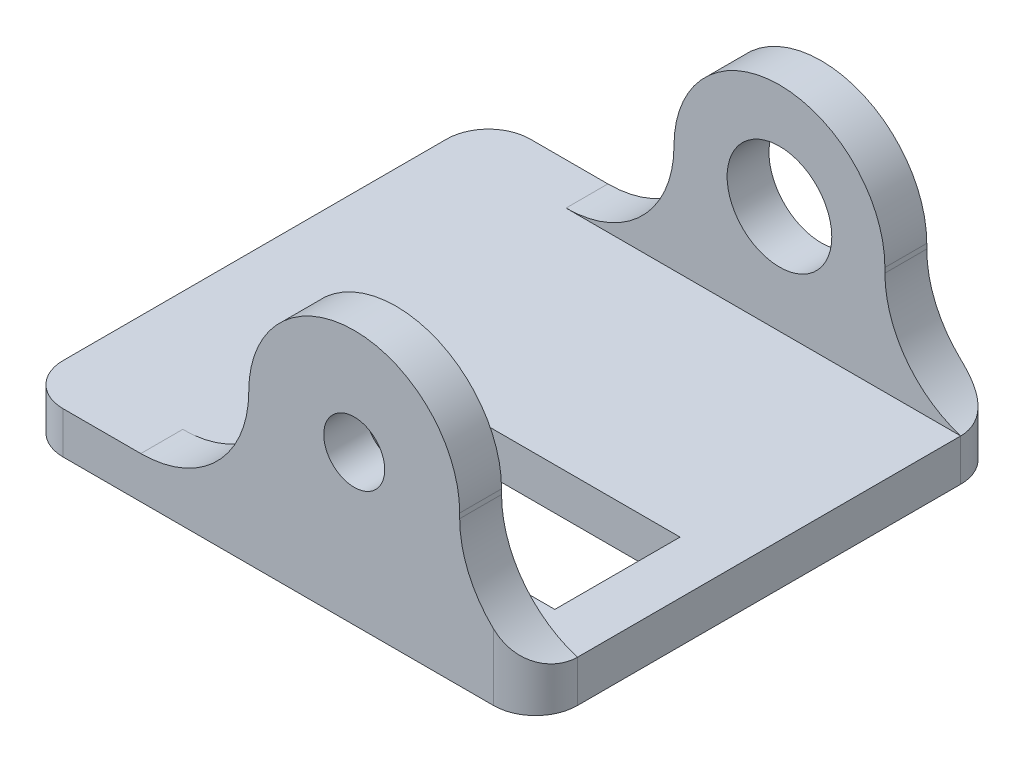
ISO-10303-21;
HEADER;
FILE_DESCRIPTION(('STEP AP214'),'2;1');
FILE_NAME('part.step','',(''),(''),'','','');
FILE_SCHEMA(('AUTOMOTIVE_DESIGN { 1 0 10303 214 1 1 1 1 }'));
ENDSEC;
DATA;
#1=APPLICATION_CONTEXT('core data for automotive mechanical design processes');
#2=APPLICATION_PROTOCOL_DEFINITION('international standard','automotive_design',2000,#1);
#3=PRODUCT_CONTEXT('',#1,'mechanical');
#4=PRODUCT('Part','Part','',(#3));
#5=PRODUCT_RELATED_PRODUCT_CATEGORY('part','',(#4));
#6=PRODUCT_DEFINITION_FORMATION('','',#4);
#7=PRODUCT_DEFINITION_CONTEXT('part definition',#1,'design');
#8=PRODUCT_DEFINITION('design','',#6,#7);
#9=PRODUCT_DEFINITION_SHAPE('','',#8);
#10=(LENGTH_UNIT() NAMED_UNIT(*) SI_UNIT(.MILLI.,.METRE.));
#11=(NAMED_UNIT(*) PLANE_ANGLE_UNIT() SI_UNIT($,.RADIAN.));
#12=(NAMED_UNIT(*) SI_UNIT($,.STERADIAN.) SOLID_ANGLE_UNIT());
#13=UNCERTAINTY_MEASURE_WITH_UNIT(LENGTH_MEASURE(1.E-05),#10,'distance_accuracy_value','');
#14=(GEOMETRIC_REPRESENTATION_CONTEXT(3) GLOBAL_UNCERTAINTY_ASSIGNED_CONTEXT((#13)) GLOBAL_UNIT_ASSIGNED_CONTEXT((#10,
#11,#12)) REPRESENTATION_CONTEXT('',''));
#15=CARTESIAN_POINT('',(0.,0.,0.));
#16=DIRECTION('',(0.,0.,1.));
#17=DIRECTION('',(1.,0.,0.));
#18=AXIS2_PLACEMENT_3D('',#15,#16,#17);
#19=CARTESIAN_POINT('',(0.,6.35,0.));
#20=DIRECTION('',(0.,-1.,0.));
#21=DIRECTION('',(0.,0.,-1.));
#22=AXIS2_PLACEMENT_3D('',#19,#20,#21);
#23=PLANE('',#22);
#24=DIRECTION('',(0.,0.,1.));
#25=VECTOR('',#24,1.);
#26=CARTESIAN_POINT('',(-50.5,6.35,0.));
#27=LINE('',#26,#25);
#28=CARTESIAN_POINT('',(-50.5,6.35,-44.08));
#29=VERTEX_POINT('',#28);
#30=CARTESIAN_POINT('',(-50.5,6.35,14.08));
#31=VERTEX_POINT('',#30);
#32=EDGE_CURVE('E506',#29,#31,#27,.T.);
#33=ORIENTED_EDGE('',*,*,#32,.T.);
#34=CARTESIAN_POINT('',(-44.15,6.34999999999999,14.08));
#35=DIRECTION('',(0.,-1.,0.));
#36=DIRECTION('',(0.,0.,-1.));
#37=AXIS2_PLACEMENT_3D('',#34,#35,#36);
#38=CIRCLE('',#37,6.35);
#39=CARTESIAN_POINT('',(-44.15,6.35,20.43));
#40=VERTEX_POINT('',#39);
#41=EDGE_CURVE('E11',#31,#40,#38,.F.);
#42=ORIENTED_EDGE('',*,*,#41,.T.);
#43=DIRECTION('',(1.,0.,0.));
#44=VECTOR('',#43,1.);
#45=CARTESIAN_POINT('',(-27.5,6.35,20.43));
#46=LINE('',#45,#44);
#47=CARTESIAN_POINT('',(-32.3799999723013,6.35,20.43));
#48=VERTEX_POINT('',#47);
#49=EDGE_CURVE('E298',#40,#48,#46,.T.);
#50=ORIENTED_EDGE('',*,*,#49,.T.);
#51=DIRECTION('',(0.,0.,1.));
#52=VECTOR('',#51,1.);
#53=CARTESIAN_POINT('',(-32.3799999723013,6.35,0.));
#54=LINE('',#53,#52);
#55=CARTESIAN_POINT('',(-32.3799999723013,6.35000000000001,14.08));
#56=VERTEX_POINT('',#55);
#57=EDGE_CURVE('E315',#48,#56,#54,.F.);
#58=ORIENTED_EDGE('',*,*,#57,.T.);
#59=DIRECTION('',(1.,0.,0.));
#60=VECTOR('',#59,1.);
#61=CARTESIAN_POINT('',(16.,6.35,14.08));
#62=LINE('',#61,#60);
#63=CARTESIAN_POINT('',(27.5,6.35,14.08));
#64=VERTEX_POINT('',#63);
#65=EDGE_CURVE('E192',#56,#64,#62,.T.);
#66=ORIENTED_EDGE('',*,*,#65,.T.);
#67=DIRECTION('',(0.,0.,-1.));
#68=VECTOR('',#67,1.);
#69=CARTESIAN_POINT('',(27.5,6.35,20.43));
#70=LINE('',#69,#68);
#71=CARTESIAN_POINT('',(27.5,6.35,-44.08));
#72=VERTEX_POINT('',#71);
#73=EDGE_CURVE('E290',#64,#72,#70,.T.);
#74=ORIENTED_EDGE('',*,*,#73,.T.);
#75=DIRECTION('',(1.,0.,0.));
#76=VECTOR('',#75,1.);
#77=CARTESIAN_POINT('',(-16.,6.35000000000001,-44.08));
#78=LINE('',#77,#76);
#79=CARTESIAN_POINT('',(-32.3799999723013,6.35000000000001,-44.08));
#80=VERTEX_POINT('',#79);
#81=EDGE_CURVE('E229',#80,#72,#78,.T.);
#82=ORIENTED_EDGE('',*,*,#81,.F.);
#83=DIRECTION('',(0.,0.,1.));
#84=VECTOR('',#83,1.);
#85=CARTESIAN_POINT('',(-32.3799999723013,6.35,-50.43));
#86=LINE('',#85,#84);
#87=CARTESIAN_POINT('',(-32.3799999723013,6.35,-50.43));
#88=VERTEX_POINT('',#87);
#89=EDGE_CURVE('E301',#80,#88,#86,.F.);
#90=ORIENTED_EDGE('',*,*,#89,.T.);
#91=DIRECTION('',(-1.,0.,0.));
#92=VECTOR('',#91,1.);
#93=CARTESIAN_POINT('',(-27.5,6.35,-50.43));
#94=LINE('',#93,#92);
#95=CARTESIAN_POINT('',(-44.15,6.35,-50.43));
#96=VERTEX_POINT('',#95);
#97=EDGE_CURVE('E294',#88,#96,#94,.T.);
#98=ORIENTED_EDGE('',*,*,#97,.T.);
#99=CARTESIAN_POINT('',(-44.15,6.35,-44.08));
#100=DIRECTION('',(0.,-1.,0.));
#101=DIRECTION('',(0.,0.,-1.));
#102=AXIS2_PLACEMENT_3D('',#99,#100,#101);
#103=CIRCLE('',#102,6.35);
#104=EDGE_CURVE('E50',#96,#29,#103,.F.);
#105=ORIENTED_EDGE('',*,*,#104,.T.);
#106=EDGE_LOOP('',(#33,#42,#50,#58,#66,#74,#82,#90,#98,#105));
#107=FACE_BOUND('',#106,.T.);
#108=DIRECTION('',(0.,0.,-1.));
#109=VECTOR('',#108,1.);
#110=CARTESIAN_POINT('',(19.5,6.35,9.5));
#111=LINE('',#110,#109);
#112=CARTESIAN_POINT('',(19.5,6.35,9.5));
#113=VERTEX_POINT('',#112);
#114=CARTESIAN_POINT('',(19.5,6.35,-9.5));
#115=VERTEX_POINT('',#114);
#116=EDGE_CURVE('E247',#113,#115,#111,.T.);
#117=ORIENTED_EDGE('',*,*,#116,.F.);
#118=DIRECTION('',(1.,0.,0.));
#119=VECTOR('',#118,1.);
#120=CARTESIAN_POINT('',(-19.5,6.35,9.5));
#121=LINE('',#120,#119);
#122=CARTESIAN_POINT('',(-19.5,6.35,9.5));
#123=VERTEX_POINT('',#122);
#124=EDGE_CURVE('E258',#123,#113,#121,.T.);
#125=ORIENTED_EDGE('',*,*,#124,.F.);
#126=DIRECTION('',(0.,0.,1.));
#127=VECTOR('',#126,1.);
#128=CARTESIAN_POINT('',(-19.5,6.35,9.5));
#129=LINE('',#128,#127);
#130=CARTESIAN_POINT('',(-19.5,6.35,-9.5));
#131=VERTEX_POINT('',#130);
#132=EDGE_CURVE('E254',#131,#123,#129,.T.);
#133=ORIENTED_EDGE('',*,*,#132,.F.);
#134=DIRECTION('',(-1.,0.,0.));
#135=VECTOR('',#134,1.);
#136=CARTESIAN_POINT('',(-19.5,6.35,-9.5));
#137=LINE('',#136,#135);
#138=EDGE_CURVE('E250',#115,#131,#137,.T.);
#139=ORIENTED_EDGE('',*,*,#138,.F.);
#140=EDGE_LOOP('',(#117,#125,#133,#139));
#141=FACE_BOUND('',#140,.T.);
#142=ADVANCED_FACE('F41',(#107,#141),#23,.F.);
#143=CARTESIAN_POINT('',(0.,0.,0.));
#144=DIRECTION('',(0.,-1.,0.));
#145=DIRECTION('',(0.,0.,-1.));
#146=AXIS2_PLACEMENT_3D('',#143,#144,#145);
#147=PLANE('',#146);
#148=DIRECTION('',(-1.,0.,0.));
#149=VECTOR('',#148,1.);
#150=CARTESIAN_POINT('',(-27.5,0.,-50.43));
#151=LINE('',#150,#149);
#152=CARTESIAN_POINT('',(21.15,0.,-50.43));
#153=VERTEX_POINT('',#152);
#154=CARTESIAN_POINT('',(-44.15,0.,-50.43));
#155=VERTEX_POINT('',#154);
#156=EDGE_CURVE('E305',#153,#155,#151,.T.);
#157=ORIENTED_EDGE('',*,*,#156,.F.);
#158=CARTESIAN_POINT('',(21.15,0.,-44.08));
#159=DIRECTION('',(0.,-1.,0.));
#160=DIRECTION('',(0.,0.,-1.));
#161=AXIS2_PLACEMENT_3D('',#158,#159,#160);
#162=CIRCLE('',#161,6.35);
#163=CARTESIAN_POINT('',(27.5,0.,-44.08));
#164=VERTEX_POINT('',#163);
#165=EDGE_CURVE('E374',#153,#164,#162,.T.);
#166=ORIENTED_EDGE('',*,*,#165,.T.);
#167=DIRECTION('',(0.,0.,-1.));
#168=VECTOR('',#167,1.);
#169=CARTESIAN_POINT('',(27.5,0.,20.43));
#170=LINE('',#169,#168);
#171=CARTESIAN_POINT('',(27.5,0.,14.08));
#172=VERTEX_POINT('',#171);
#173=EDGE_CURVE('E289',#172,#164,#170,.T.);
#174=ORIENTED_EDGE('',*,*,#173,.F.);
#175=CARTESIAN_POINT('',(21.15,0.,14.08));
#176=DIRECTION('',(0.,-1.,0.));
#177=DIRECTION('',(0.,0.,-1.));
#178=AXIS2_PLACEMENT_3D('',#175,#176,#177);
#179=CIRCLE('',#178,6.35);
#180=CARTESIAN_POINT('',(21.15,0.,20.43));
#181=VERTEX_POINT('',#180);
#182=EDGE_CURVE('E371',#172,#181,#179,.T.);
#183=ORIENTED_EDGE('',*,*,#182,.T.);
#184=DIRECTION('',(1.,0.,0.));
#185=VECTOR('',#184,1.);
#186=CARTESIAN_POINT('',(-27.5,0.,20.43));
#187=LINE('',#186,#185);
#188=CARTESIAN_POINT('',(-44.15,0.,20.43));
#189=VERTEX_POINT('',#188);
#190=EDGE_CURVE('E295',#189,#181,#187,.T.);
#191=ORIENTED_EDGE('',*,*,#190,.F.);
#192=CARTESIAN_POINT('',(-44.15,0.,14.08));
#193=DIRECTION('',(0.,-1.,0.));
#194=DIRECTION('',(0.,0.,-1.));
#195=AXIS2_PLACEMENT_3D('',#192,#193,#194);
#196=CIRCLE('',#195,6.35);
#197=CARTESIAN_POINT('',(-50.5,0.,14.08));
#198=VERTEX_POINT('',#197);
#199=EDGE_CURVE('E368',#189,#198,#196,.T.);
#200=ORIENTED_EDGE('',*,*,#199,.T.);
#201=DIRECTION('',(0.,0.,1.));
#202=VECTOR('',#201,1.);
#203=CARTESIAN_POINT('',(-50.5,0.,0.));
#204=LINE('',#203,#202);
#205=CARTESIAN_POINT('',(-50.5,0.,-44.08));
#206=VERTEX_POINT('',#205);
#207=EDGE_CURVE('E214',#206,#198,#204,.T.);
#208=ORIENTED_EDGE('',*,*,#207,.F.);
#209=CARTESIAN_POINT('',(-44.15,0.,-44.08));
#210=DIRECTION('',(0.,-1.,0.));
#211=DIRECTION('',(0.,0.,-1.));
#212=AXIS2_PLACEMENT_3D('',#209,#210,#211);
#213=CIRCLE('',#212,6.35);
#214=EDGE_CURVE('E365',#206,#155,#213,.T.);
#215=ORIENTED_EDGE('',*,*,#214,.T.);
#216=EDGE_LOOP('',(#157,#166,#174,#183,#191,#200,#208,#215));
#217=FACE_BOUND('',#216,.T.);
#218=DIRECTION('',(1.,0.,0.));
#219=VECTOR('',#218,1.);
#220=CARTESIAN_POINT('',(-19.5,0.,9.5));
#221=LINE('',#220,#219);
#222=CARTESIAN_POINT('',(-19.5,0.,9.5));
#223=VERTEX_POINT('',#222);
#224=CARTESIAN_POINT('',(19.5,0.,9.5));
#225=VERTEX_POINT('',#224);
#226=EDGE_CURVE('E251',#223,#225,#221,.T.);
#227=ORIENTED_EDGE('',*,*,#226,.T.);
#228=DIRECTION('',(0.,0.,-1.));
#229=VECTOR('',#228,1.);
#230=CARTESIAN_POINT('',(19.5,0.,9.5));
#231=LINE('',#230,#229);
#232=CARTESIAN_POINT('',(19.5,0.,-9.5));
#233=VERTEX_POINT('',#232);
#234=EDGE_CURVE('E246',#225,#233,#231,.T.);
#235=ORIENTED_EDGE('',*,*,#234,.T.);
#236=DIRECTION('',(-1.,0.,0.));
#237=VECTOR('',#236,1.);
#238=CARTESIAN_POINT('',(-19.5,0.,-9.5));
#239=LINE('',#238,#237);
#240=CARTESIAN_POINT('',(-19.5,0.,-9.5));
#241=VERTEX_POINT('',#240);
#242=EDGE_CURVE('E265',#233,#241,#239,.T.);
#243=ORIENTED_EDGE('',*,*,#242,.T.);
#244=DIRECTION('',(0.,0.,1.));
#245=VECTOR('',#244,1.);
#246=CARTESIAN_POINT('',(-19.5,0.,9.5));
#247=LINE('',#246,#245);
#248=EDGE_CURVE('E269',#241,#223,#247,.T.);
#249=ORIENTED_EDGE('',*,*,#248,.T.);
#250=EDGE_LOOP('',(#227,#235,#243,#249));
#251=FACE_BOUND('',#250,.T.);
#252=ADVANCED_FACE('F421',(#217,#251),#147,.T.);
#253=CARTESIAN_POINT('',(27.5,6.35,20.43));
#254=DIRECTION('',(-1.,0.,0.));
#255=DIRECTION('',(0.,0.,1.));
#256=AXIS2_PLACEMENT_3D('',#253,#254,#255);
#257=PLANE('',#256);
#258=ORIENTED_EDGE('',*,*,#173,.T.);
#259=DIRECTION('',(0.,-1.,0.));
#260=VECTOR('',#259,1.);
#261=CARTESIAN_POINT('',(27.5,6.35,-44.08));
#262=LINE('',#261,#260);
#263=EDGE_CURVE('E381',#164,#72,#262,.F.);
#264=ORIENTED_EDGE('',*,*,#263,.T.);
#265=ORIENTED_EDGE('',*,*,#73,.F.);
#266=DIRECTION('',(0.,-1.,0.));
#267=VECTOR('',#266,1.);
#268=CARTESIAN_POINT('',(27.5,6.35,14.08));
#269=LINE('',#268,#267);
#270=EDGE_CURVE('E377',#64,#172,#269,.T.);
#271=ORIENTED_EDGE('',*,*,#270,.T.);
#272=EDGE_LOOP('',(#258,#264,#265,#271));
#273=FACE_BOUND('',#272,.T.);
#274=ADVANCED_FACE('F426',(#273),#257,.F.);
#275=CARTESIAN_POINT('',(-27.5,6.35,-50.43));
#276=DIRECTION('',(0.,0.,1.));
#277=DIRECTION('',(1.,0.,0.));
#278=AXIS2_PLACEMENT_3D('',#275,#276,#277);
#279=PLANE('',#278);
#280=CARTESIAN_POINT('',(32.38,21.9861760031025,-50.43));
#281=DIRECTION('',(0.,0.,1.));
#282=DIRECTION('',(1.,0.,0.));
#283=AXIS2_PLACEMENT_3D('',#280,#281,#282);
#284=CIRCLE('',#283,16.38);
#285=CARTESIAN_POINT('',(16.,21.9861760031025,-50.43));
#286=VERTEX_POINT('',#285);
#287=CARTESIAN_POINT('',(21.15,10.0617682609965,-50.43));
#288=VERTEX_POINT('',#287);
#289=EDGE_CURVE('E337',#286,#288,#284,.T.);
#290=ORIENTED_EDGE('',*,*,#289,.T.);
#291=DIRECTION('',(0.,-1.,0.));
#292=VECTOR('',#291,1.);
#293=CARTESIAN_POINT('',(21.15,6.35,-50.43));
#294=LINE('',#293,#292);
#295=EDGE_CURVE('E361',#288,#153,#294,.T.);
#296=ORIENTED_EDGE('',*,*,#295,.T.);
#297=ORIENTED_EDGE('',*,*,#156,.T.);
#298=DIRECTION('',(0.,1.,0.));
#299=VECTOR('',#298,1.);
#300=CARTESIAN_POINT('',(-44.15,6.35,-50.43));
#301=LINE('',#300,#299);
#302=EDGE_CURVE('E357',#155,#96,#301,.T.);
#303=ORIENTED_EDGE('',*,*,#302,.T.);
#304=ORIENTED_EDGE('',*,*,#97,.F.);
#305=CARTESIAN_POINT('',(-32.3799999723013,22.73,-50.43));
#306=DIRECTION('',(0.,0.,1.));
#307=DIRECTION('',(1.,0.,0.));
#308=AXIS2_PLACEMENT_3D('',#305,#306,#307);
#309=CIRCLE('',#308,16.38);
#310=CARTESIAN_POINT('',(-15.9999999863132,22.7293224833482,-50.43));
#311=VERTEX_POINT('',#310);
#312=EDGE_CURVE('E350',#88,#311,#309,.T.);
#313=ORIENTED_EDGE('',*,*,#312,.T.);
#314=CARTESIAN_POINT('',(0.,22.7286606844209,-50.43));
#315=DIRECTION('',(0.,0.,1.));
#316=DIRECTION('',(1.,0.,0.));
#317=AXIS2_PLACEMENT_3D('',#314,#315,#316);
#318=CIRCLE('',#317,16.);
#319=CARTESIAN_POINT('',(16.,22.7286606844209,-50.43));
#320=VERTEX_POINT('',#319);
#321=EDGE_CURVE('E221',#320,#311,#318,.T.);
#322=ORIENTED_EDGE('',*,*,#321,.F.);
#323=DIRECTION('',(0.,1.,0.));
#324=VECTOR('',#323,1.);
#325=CARTESIAN_POINT('',(16.,22.7286606844209,-50.43));
#326=LINE('',#325,#324);
#327=EDGE_CURVE('E230',#286,#320,#326,.T.);
#328=ORIENTED_EDGE('',*,*,#327,.F.);
#329=EDGE_LOOP('',(#290,#296,#297,#303,#304,#313,#322,#328));
#330=FACE_BOUND('',#329,.T.);
#331=CARTESIAN_POINT('',(0.,22.7286606844209,-50.43));
#332=DIRECTION('',(0.,0.,1.));
#333=DIRECTION('',(1.,0.,0.));
#334=AXIS2_PLACEMENT_3D('',#331,#332,#333);
#335=CIRCLE('',#334,7.94);
#336=CARTESIAN_POINT('',(7.94,22.7286606844209,-50.43));
#337=VERTEX_POINT('',#336);
#338=EDGE_CURVE('E202',#337,#337,#335,.T.);
#339=ORIENTED_EDGE('',*,*,#338,.T.);
#340=EDGE_LOOP('',(#339));
#341=FACE_BOUND('',#340,.T.);
#342=ADVANCED_FACE('F437',(#330,#341),#279,.F.);
#343=CARTESIAN_POINT('',(-27.5,6.35,20.43));
#344=DIRECTION('',(0.,0.,-1.));
#345=DIRECTION('',(-1.,0.,0.));
#346=AXIS2_PLACEMENT_3D('',#343,#344,#345);
#347=PLANE('',#346);
#348=CARTESIAN_POINT('',(0.,22.7286606844209,20.43));
#349=DIRECTION('',(0.,0.,-1.));
#350=DIRECTION('',(-1.,0.,0.));
#351=AXIS2_PLACEMENT_3D('',#348,#349,#350);
#352=CIRCLE('',#351,4.625);
#353=CARTESIAN_POINT('',(-4.625,22.7286606844209,20.43));
#354=VERTEX_POINT('',#353);
#355=EDGE_CURVE('E509',#354,#354,#352,.F.);
#356=ORIENTED_EDGE('',*,*,#355,.F.);
#357=EDGE_LOOP('',(#356));
#358=FACE_BOUND('',#357,.T.);
#359=ORIENTED_EDGE('',*,*,#190,.T.);
#360=DIRECTION('',(0.,-1.,0.));
#361=VECTOR('',#360,1.);
#362=CARTESIAN_POINT('',(21.15,6.35,20.43));
#363=LINE('',#362,#361);
#364=CARTESIAN_POINT('',(21.15,10.0617682609965,20.43));
#365=VERTEX_POINT('',#364);
#366=EDGE_CURVE('E488',#181,#365,#363,.F.);
#367=ORIENTED_EDGE('',*,*,#366,.T.);
#368=CARTESIAN_POINT('',(32.38,21.9861760031025,20.43));
#369=DIRECTION('',(0.,0.,-1.));
#370=DIRECTION('',(-1.,0.,0.));
#371=AXIS2_PLACEMENT_3D('',#368,#369,#370);
#372=CIRCLE('',#371,16.38);
#373=CARTESIAN_POINT('',(16.,21.9861760031025,20.43));
#374=VERTEX_POINT('',#373);
#375=EDGE_CURVE('E331',#365,#374,#372,.T.);
#376=ORIENTED_EDGE('',*,*,#375,.T.);
#377=DIRECTION('',(0.,1.,0.));
#378=VECTOR('',#377,1.);
#379=CARTESIAN_POINT('',(16.,6.35,20.43));
#380=LINE('',#379,#378);
#381=CARTESIAN_POINT('',(16.,22.7286606844209,20.43));
#382=VERTEX_POINT('',#381);
#383=EDGE_CURVE('E211',#374,#382,#380,.T.);
#384=ORIENTED_EDGE('',*,*,#383,.T.);
#385=CARTESIAN_POINT('',(0.,22.7286606844209,20.43));
#386=DIRECTION('',(0.,0.,1.));
#387=DIRECTION('',(-1.,0.,0.));
#388=AXIS2_PLACEMENT_3D('',#385,#386,#387);
#389=CIRCLE('',#388,16.);
#390=CARTESIAN_POINT('',(-15.9999999863132,22.7293224833482,20.43));
#391=VERTEX_POINT('',#390);
#392=EDGE_CURVE('E200',#382,#391,#389,.T.);
#393=ORIENTED_EDGE('',*,*,#392,.T.);
#394=CARTESIAN_POINT('',(-32.3799999723013,22.73,20.43));
#395=DIRECTION('',(0.,0.,-1.));
#396=DIRECTION('',(-1.,0.,0.));
#397=AXIS2_PLACEMENT_3D('',#394,#395,#396);
#398=CIRCLE('',#397,16.38);
#399=EDGE_CURVE('E344',#391,#48,#398,.T.);
#400=ORIENTED_EDGE('',*,*,#399,.T.);
#401=ORIENTED_EDGE('',*,*,#49,.F.);
#402=DIRECTION('',(0.,1.,0.));
#403=VECTOR('',#402,1.);
#404=CARTESIAN_POINT('',(-44.15,0.,20.43));
#405=LINE('',#404,#403);
#406=EDGE_CURVE('E393',#40,#189,#405,.F.);
#407=ORIENTED_EDGE('',*,*,#406,.T.);
#408=EDGE_LOOP('',(#359,#367,#376,#384,#393,#400,#401,#407));
#409=FACE_BOUND('',#408,.T.);
#410=ADVANCED_FACE('F434',(#358,#409),#347,.F.);
#411=CARTESIAN_POINT('',(19.5,6.35,9.5));
#412=DIRECTION('',(-1.,0.,0.));
#413=DIRECTION('',(0.,0.,1.));
#414=AXIS2_PLACEMENT_3D('',#411,#412,#413);
#415=PLANE('',#414);
#416=ORIENTED_EDGE('',*,*,#234,.F.);
#417=DIRECTION('',(0.,-1.,0.));
#418=VECTOR('',#417,1.);
#419=CARTESIAN_POINT('',(19.5,6.35,9.5));
#420=LINE('',#419,#418);
#421=EDGE_CURVE('E261',#113,#225,#420,.T.);
#422=ORIENTED_EDGE('',*,*,#421,.F.);
#423=ORIENTED_EDGE('',*,*,#116,.T.);
#424=DIRECTION('',(0.,-1.,0.));
#425=VECTOR('',#424,1.);
#426=CARTESIAN_POINT('',(19.5,6.35,-9.5));
#427=LINE('',#426,#425);
#428=EDGE_CURVE('E285',#115,#233,#427,.T.);
#429=ORIENTED_EDGE('',*,*,#428,.T.);
#430=EDGE_LOOP('',(#416,#422,#423,#429));
#431=FACE_BOUND('',#430,.T.);
#432=ADVANCED_FACE('F431',(#431),#415,.T.);
#433=CARTESIAN_POINT('',(-19.5,6.35,-9.5));
#434=DIRECTION('',(0.,0.,1.));
#435=DIRECTION('',(1.,0.,0.));
#436=AXIS2_PLACEMENT_3D('',#433,#434,#435);
#437=PLANE('',#436);
#438=ORIENTED_EDGE('',*,*,#242,.F.);
#439=ORIENTED_EDGE('',*,*,#428,.F.);
#440=ORIENTED_EDGE('',*,*,#138,.T.);
#441=DIRECTION('',(0.,-1.,0.));
#442=VECTOR('',#441,1.);
#443=CARTESIAN_POINT('',(-19.5,6.35,-9.5));
#444=LINE('',#443,#442);
#445=EDGE_CURVE('E282',#131,#241,#444,.T.);
#446=ORIENTED_EDGE('',*,*,#445,.T.);
#447=EDGE_LOOP('',(#438,#439,#440,#446));
#448=FACE_BOUND('',#447,.T.);
#449=ADVANCED_FACE('F555',(#448),#437,.T.);
#450=CARTESIAN_POINT('',(-19.5,6.35,9.5));
#451=DIRECTION('',(1.,0.,0.));
#452=DIRECTION('',(0.,0.,-1.));
#453=AXIS2_PLACEMENT_3D('',#450,#451,#452);
#454=PLANE('',#453);
#455=ORIENTED_EDGE('',*,*,#248,.F.);
#456=ORIENTED_EDGE('',*,*,#445,.F.);
#457=ORIENTED_EDGE('',*,*,#132,.T.);
#458=DIRECTION('',(0.,-1.,0.));
#459=VECTOR('',#458,1.);
#460=CARTESIAN_POINT('',(-19.5,6.35,9.5));
#461=LINE('',#460,#459);
#462=EDGE_CURVE('E279',#123,#223,#461,.T.);
#463=ORIENTED_EDGE('',*,*,#462,.T.);
#464=EDGE_LOOP('',(#455,#456,#457,#463));
#465=FACE_BOUND('',#464,.T.);
#466=ADVANCED_FACE('F552',(#465),#454,.T.);
#467=CARTESIAN_POINT('',(-19.5,6.35,9.5));
#468=DIRECTION('',(0.,0.,-1.));
#469=DIRECTION('',(-1.,0.,0.));
#470=AXIS2_PLACEMENT_3D('',#467,#468,#469);
#471=PLANE('',#470);
#472=ORIENTED_EDGE('',*,*,#226,.F.);
#473=ORIENTED_EDGE('',*,*,#462,.F.);
#474=ORIENTED_EDGE('',*,*,#124,.T.);
#475=ORIENTED_EDGE('',*,*,#421,.T.);
#476=EDGE_LOOP('',(#472,#473,#474,#475));
#477=FACE_BOUND('',#476,.T.);
#478=ADVANCED_FACE('F545',(#477),#471,.T.);
#479=CARTESIAN_POINT('',(0.,22.7286606844209,-44.08));
#480=DIRECTION('',(0.,0.,1.));
#481=DIRECTION('',(1.,0.,0.));
#482=AXIS2_PLACEMENT_3D('',#479,#480,#481);
#483=PLANE('',#482);
#484=CARTESIAN_POINT('',(0.,22.7286606844209,-44.08));
#485=DIRECTION('',(0.,0.,1.));
#486=DIRECTION('',(1.,0.,0.));
#487=AXIS2_PLACEMENT_3D('',#484,#485,#486);
#488=CIRCLE('',#487,16.);
#489=CARTESIAN_POINT('',(16.,22.7286606844209,-44.08));
#490=VERTEX_POINT('',#489);
#491=CARTESIAN_POINT('',(-15.9999999863132,22.7293224833482,-44.08));
#492=VERTEX_POINT('',#491);
#493=EDGE_CURVE('E225',#490,#492,#488,.T.);
#494=ORIENTED_EDGE('',*,*,#493,.T.);
#495=CARTESIAN_POINT('',(-32.3799999723013,22.73,-44.08));
#496=DIRECTION('',(0.,0.,1.));
#497=DIRECTION('',(1.,0.,0.));
#498=AXIS2_PLACEMENT_3D('',#495,#496,#497);
#499=CIRCLE('',#498,16.38);
#500=EDGE_CURVE('E353',#492,#80,#499,.F.);
#501=ORIENTED_EDGE('',*,*,#500,.T.);
#502=ORIENTED_EDGE('',*,*,#81,.T.);
#503=CARTESIAN_POINT('',(32.38,21.9861760031025,-44.08));
#504=DIRECTION('',(0.,0.,1.));
#505=DIRECTION('',(1.,0.,0.));
#506=AXIS2_PLACEMENT_3D('',#503,#504,#505);
#507=CIRCLE('',#506,16.38);
#508=CARTESIAN_POINT('',(16.,21.9861760031025,-44.08));
#509=VERTEX_POINT('',#508);
#510=EDGE_CURVE('E341',#72,#509,#507,.F.);
#511=ORIENTED_EDGE('',*,*,#510,.T.);
#512=DIRECTION('',(0.,1.,0.));
#513=VECTOR('',#512,1.);
#514=CARTESIAN_POINT('',(16.,22.7286606844209,-44.08));
#515=LINE('',#514,#513);
#516=EDGE_CURVE('E234',#509,#490,#515,.T.);
#517=ORIENTED_EDGE('',*,*,#516,.T.);
#518=EDGE_LOOP('',(#494,#501,#502,#511,#517));
#519=FACE_BOUND('',#518,.T.);
#520=CARTESIAN_POINT('',(0.,22.7286606844209,-44.08));
#521=DIRECTION('',(0.,0.,1.));
#522=DIRECTION('',(1.,0.,0.));
#523=AXIS2_PLACEMENT_3D('',#520,#521,#522);
#524=CIRCLE('',#523,7.94);
#525=CARTESIAN_POINT('',(7.94,22.7286606844209,-44.08));
#526=VERTEX_POINT('',#525);
#527=EDGE_CURVE('E217',#526,#526,#524,.T.);
#528=ORIENTED_EDGE('',*,*,#527,.F.);
#529=EDGE_LOOP('',(#528));
#530=FACE_BOUND('',#529,.T.);
#531=ADVANCED_FACE('F466',(#519,#530),#483,.T.);
#532=CARTESIAN_POINT('',(0.,22.7286606844209,-44.08));
#533=DIRECTION('',(0.,0.,-1.));
#534=DIRECTION('',(-1.,0.,0.));
#535=AXIS2_PLACEMENT_3D('',#532,#533,#534);
#536=CYLINDRICAL_SURFACE('',#535,16.);
#537=ORIENTED_EDGE('',*,*,#321,.T.);
#538=DIRECTION('',(0.,0.,-1.));
#539=VECTOR('',#538,1.);
#540=CARTESIAN_POINT('',(-15.9999999863132,22.7293224833482,-44.08));
#541=LINE('',#540,#539);
#542=EDGE_CURVE('E328',#311,#492,#541,.F.);
#543=ORIENTED_EDGE('',*,*,#542,.T.);
#544=ORIENTED_EDGE('',*,*,#493,.F.);
#545=DIRECTION('',(0.,0.,-1.));
#546=VECTOR('',#545,1.);
#547=CARTESIAN_POINT('',(16.,22.7286606844209,-44.08));
#548=LINE('',#547,#546);
#549=EDGE_CURVE('E237',#490,#320,#548,.T.);
#550=ORIENTED_EDGE('',*,*,#549,.T.);
#551=EDGE_LOOP('',(#537,#543,#544,#550));
#552=FACE_BOUND('',#551,.T.);
#553=ADVANCED_FACE('F463',(#552),#536,.T.);
#554=CARTESIAN_POINT('',(16.,22.7286606844209,-44.08));
#555=DIRECTION('',(-1.,0.,0.));
#556=DIRECTION('',(0.,-1.,0.));
#557=AXIS2_PLACEMENT_3D('',#554,#555,#556);
#558=PLANE('',#557);
#559=ORIENTED_EDGE('',*,*,#516,.F.);
#560=DIRECTION('',(0.,0.,-1.));
#561=VECTOR('',#560,1.);
#562=CARTESIAN_POINT('',(16.,21.9861760031025,-44.08));
#563=LINE('',#562,#561);
#564=EDGE_CURVE('E321',#509,#286,#563,.T.);
#565=ORIENTED_EDGE('',*,*,#564,.T.);
#566=ORIENTED_EDGE('',*,*,#327,.T.);
#567=ORIENTED_EDGE('',*,*,#549,.F.);
#568=EDGE_LOOP('',(#559,#565,#566,#567));
#569=FACE_BOUND('',#568,.T.);
#570=ADVANCED_FACE('F460',(#569),#558,.F.);
#571=CARTESIAN_POINT('',(0.,22.7286606844209,-44.08));
#572=DIRECTION('',(0.,0.,-1.));
#573=DIRECTION('',(-1.,0.,0.));
#574=AXIS2_PLACEMENT_3D('',#571,#572,#573);
#575=CYLINDRICAL_SURFACE('',#574,7.94);
#576=ORIENTED_EDGE('',*,*,#527,.T.);
#577=EDGE_LOOP('',(#576));
#578=FACE_BOUND('',#577,.T.);
#579=ORIENTED_EDGE('',*,*,#338,.F.);
#580=EDGE_LOOP('',(#579));
#581=FACE_BOUND('',#580,.T.);
#582=ADVANCED_FACE('F537',(#578,#581),#575,.F.);
#583=CARTESIAN_POINT('',(0.,22.7286606844209,14.08));
#584=DIRECTION('',(0.,0.,1.));
#585=DIRECTION('',(1.,0.,0.));
#586=AXIS2_PLACEMENT_3D('',#583,#584,#585);
#587=CYLINDRICAL_SURFACE('',#586,16.);
#588=CARTESIAN_POINT('',(0.,22.7286606844209,14.08));
#589=DIRECTION('',(0.,0.,1.));
#590=DIRECTION('',(-1.,0.,0.));
#591=AXIS2_PLACEMENT_3D('',#588,#589,#590);
#592=CIRCLE('',#591,16.);
#593=CARTESIAN_POINT('',(16.,22.7286606844209,14.08));
#594=VERTEX_POINT('',#593);
#595=CARTESIAN_POINT('',(-15.9999999863132,22.7293224833482,14.08));
#596=VERTEX_POINT('',#595);
#597=EDGE_CURVE('E191',#594,#596,#592,.T.);
#598=ORIENTED_EDGE('',*,*,#597,.T.);
#599=DIRECTION('',(0.,0.,1.));
#600=VECTOR('',#599,1.);
#601=CARTESIAN_POINT('',(-15.9999999863132,22.7293224833482,14.08));
#602=LINE('',#601,#600);
#603=EDGE_CURVE('E325',#596,#391,#602,.T.);
#604=ORIENTED_EDGE('',*,*,#603,.T.);
#605=ORIENTED_EDGE('',*,*,#392,.F.);
#606=DIRECTION('',(0.,0.,1.));
#607=VECTOR('',#606,1.);
#608=CARTESIAN_POINT('',(16.,22.7286606844209,14.08));
#609=LINE('',#608,#607);
#610=EDGE_CURVE('E182',#594,#382,#609,.T.);
#611=ORIENTED_EDGE('',*,*,#610,.F.);
#612=EDGE_LOOP('',(#598,#604,#605,#611));
#613=FACE_BOUND('',#612,.T.);
#614=ADVANCED_FACE('F196',(#613),#587,.T.);
#615=CARTESIAN_POINT('',(16.,6.35,14.08));
#616=DIRECTION('',(1.,0.,0.));
#617=DIRECTION('',(0.,1.,0.));
#618=AXIS2_PLACEMENT_3D('',#615,#616,#617);
#619=PLANE('',#618);
#620=ORIENTED_EDGE('',*,*,#383,.F.);
#621=DIRECTION('',(0.,0.,1.));
#622=VECTOR('',#621,1.);
#623=CARTESIAN_POINT('',(16.,21.9861760031025,14.08));
#624=LINE('',#623,#622);
#625=CARTESIAN_POINT('',(16.,21.9861760031025,14.08));
#626=VERTEX_POINT('',#625);
#627=EDGE_CURVE('E185',#374,#626,#624,.F.);
#628=ORIENTED_EDGE('',*,*,#627,.T.);
#629=DIRECTION('',(0.,1.,0.));
#630=VECTOR('',#629,1.);
#631=CARTESIAN_POINT('',(16.,6.35,14.08));
#632=LINE('',#631,#630);
#633=EDGE_CURVE('E178',#626,#594,#632,.T.);
#634=ORIENTED_EDGE('',*,*,#633,.T.);
#635=ORIENTED_EDGE('',*,*,#610,.T.);
#636=EDGE_LOOP('',(#620,#628,#634,#635));
#637=FACE_BOUND('',#636,.T.);
#638=ADVANCED_FACE('F181',(#637),#619,.T.);
#639=CARTESIAN_POINT('',(0.,22.7286606844209,14.08));
#640=DIRECTION('',(0.,0.,-1.));
#641=DIRECTION('',(-1.,0.,0.));
#642=AXIS2_PLACEMENT_3D('',#639,#640,#641);
#643=PLANE('',#642);
#644=CARTESIAN_POINT('',(0.,22.7286606844209,14.08));
#645=DIRECTION('',(0.,0.,-1.));
#646=DIRECTION('',(-1.,0.,0.));
#647=AXIS2_PLACEMENT_3D('',#644,#645,#646);
#648=CIRCLE('',#647,4.625);
#649=CARTESIAN_POINT('',(-4.625,22.7286606844209,14.08));
#650=VERTEX_POINT('',#649);
#651=EDGE_CURVE('E737',#650,#650,#648,.T.);
#652=ORIENTED_EDGE('',*,*,#651,.F.);
#653=EDGE_LOOP('',(#652));
#654=FACE_BOUND('',#653,.T.);
#655=ORIENTED_EDGE('',*,*,#65,.F.);
#656=CARTESIAN_POINT('',(-32.3799999723013,22.73,14.08));
#657=DIRECTION('',(0.,0.,-1.));
#658=DIRECTION('',(-1.,0.,0.));
#659=AXIS2_PLACEMENT_3D('',#656,#657,#658);
#660=CIRCLE('',#659,16.38);
#661=EDGE_CURVE('E206',#56,#596,#660,.F.);
#662=ORIENTED_EDGE('',*,*,#661,.T.);
#663=ORIENTED_EDGE('',*,*,#597,.F.);
#664=ORIENTED_EDGE('',*,*,#633,.F.);
#665=CARTESIAN_POINT('',(32.38,21.9861760031025,14.08));
#666=DIRECTION('',(0.,0.,-1.));
#667=DIRECTION('',(-1.,0.,0.));
#668=AXIS2_PLACEMENT_3D('',#665,#666,#667);
#669=CIRCLE('',#668,16.38);
#670=EDGE_CURVE('E334',#626,#64,#669,.F.);
#671=ORIENTED_EDGE('',*,*,#670,.T.);
#672=EDGE_LOOP('',(#655,#662,#663,#664,#671));
#673=FACE_BOUND('',#672,.T.);
#674=ADVANCED_FACE('F204',(#654,#673),#643,.T.);
#675=CARTESIAN_POINT('',(-50.5,-74.4992590567182,0.));
#676=DIRECTION('',(-1.,0.,0.));
#677=DIRECTION('',(0.,0.,1.));
#678=AXIS2_PLACEMENT_3D('',#675,#676,#677);
#679=PLANE('',#678);
#680=ORIENTED_EDGE('',*,*,#207,.T.);
#681=DIRECTION('',(0.,1.,0.));
#682=VECTOR('',#681,1.);
#683=CARTESIAN_POINT('',(-50.5,6.34999999999999,14.08));
#684=LINE('',#683,#682);
#685=EDGE_CURVE('E476',#198,#31,#684,.T.);
#686=ORIENTED_EDGE('',*,*,#685,.T.);
#687=ORIENTED_EDGE('',*,*,#32,.F.);
#688=DIRECTION('',(0.,1.,0.));
#689=VECTOR('',#688,1.);
#690=CARTESIAN_POINT('',(-50.5,0.,-44.08));
#691=LINE('',#690,#689);
#692=EDGE_CURVE('E474',#29,#206,#691,.F.);
#693=ORIENTED_EDGE('',*,*,#692,.T.);
#694=EDGE_LOOP('',(#680,#686,#687,#693));
#695=FACE_BOUND('',#694,.T.);
#696=ADVANCED_FACE('F504',(#695),#679,.T.);
#697=CARTESIAN_POINT('',(32.38,21.9861760031025,0.));
#698=DIRECTION('',(0.,0.,-1.));
#699=DIRECTION('',(-1.,0.,0.));
#700=AXIS2_PLACEMENT_3D('',#697,#698,#699);
#701=CYLINDRICAL_SURFACE('',#700,16.38);
#702=ORIENTED_EDGE('',*,*,#375,.F.);
#703=CARTESIAN_POINT('',(21.15,10.0617682609965,20.43));
#704=CARTESIAN_POINT('',(21.3155685686885,9.90579257991891,20.4300031038767));
#705=CARTESIAN_POINT('',(21.4845107218488,9.75324465948336,20.4235218253309));
#706=CARTESIAN_POINT('',(21.8281543038112,9.45563784660143,20.3960401581625));
#707=CARTESIAN_POINT('',(22.0028640496788,9.31059061914236,20.3750178445383));
#708=CARTESIAN_POINT('',(22.3574850499217,9.0283487134689,20.3167403079808));
#709=CARTESIAN_POINT('',(22.5374189795123,8.89119976969173,20.279399570308));
#710=CARTESIAN_POINT('',(22.8997243701346,8.62657208577169,20.1870349931549));
#711=CARTESIAN_POINT('',(23.0820942168045,8.49908728181356,20.1320223574294));
#712=CARTESIAN_POINT('',(23.4134912963778,8.27711818598831,20.0149844846957));
#713=CARTESIAN_POINT('',(23.5624667191354,8.18088309839765,19.9561221812227));
#714=CARTESIAN_POINT('',(23.8592345593707,7.99576784717086,19.8253310850539));
#715=CARTESIAN_POINT('',(24.0070271938509,7.90688630510072,19.7534047493464));
#716=CARTESIAN_POINT('',(24.2995270613094,7.73700433656712,19.5963810471352));
#717=CARTESIAN_POINT('',(24.4442412222842,7.65598432350317,19.5113178578842));
#718=CARTESIAN_POINT('',(24.7293208040057,7.50177847354084,19.3278274764395));
#719=CARTESIAN_POINT('',(24.86968627896,7.42859253896048,19.2294004509123));
#720=CARTESIAN_POINT('',(25.1450858942727,7.28977072972421,19.0188249194935));
#721=CARTESIAN_POINT('',(25.2800878352526,7.22417692671479,18.9066064537548));
#722=CARTESIAN_POINT('',(25.5422340871944,7.10093693141305,18.6693390139224));
#723=CARTESIAN_POINT('',(25.6693781930917,7.04329094648541,18.5442897052105));
#724=CARTESIAN_POINT('',(25.9142206609249,6.93572758609535,18.2820124089214));
#725=CARTESIAN_POINT('',(26.0319124325979,6.8858155806922,18.1447760624102));
#726=CARTESIAN_POINT('',(26.2561996114235,6.79347433504773,17.8591781570379));
#727=CARTESIAN_POINT('',(26.3627958512989,6.75104453309866,17.7108174345042));
#728=CARTESIAN_POINT('',(26.555675268506,6.67632648772393,17.4161241295165));
#729=CARTESIAN_POINT('',(26.6428946897652,6.64350500415057,17.270538029719));
#730=CARTESIAN_POINT('',(26.8058063798268,6.58356904727752,16.9719338741066));
#731=CARTESIAN_POINT('',(26.8814988904806,6.55645445423434,16.8189159743107));
#732=CARTESIAN_POINT('',(27.0205400958457,6.50760930079477,16.5066131732893));
#733=CARTESIAN_POINT('',(27.083893985532,6.48587647344284,16.3473309436572));
#734=CARTESIAN_POINT('',(27.1976491347717,6.44747520369398,16.0236813391784));
#735=CARTESIAN_POINT('',(27.2480521677787,6.43080606783243,15.8593146640387));
#736=CARTESIAN_POINT('',(27.3606227370183,6.39400983407445,15.4305800954362));
#737=CARTESIAN_POINT('',(27.4128278221736,6.37742690825341,15.1631758595544));
#738=CARTESIAN_POINT('',(27.4650905837554,6.36092903665071,14.7587307991509));
#739=CARTESIAN_POINT('',(27.478170684299,6.35682582087757,14.6233782538077));
#740=CARTESIAN_POINT('',(27.4956251686562,6.35136446002146,14.3520349359466));
#741=CARTESIAN_POINT('',(27.4999980971899,6.35000677381403,14.2160440605474));
#742=CARTESIAN_POINT('',(27.5,6.35,14.08));
#743=B_SPLINE_CURVE_WITH_KNOTS('',3,(#703,#704,#705,#706,#707,#708,#709,#710,#711,#712,#713,
#714,#715,#716,#717,#718,#719,#720,#721,#722,#723,#724,#725,#726,#727,#728,#729,#730,#731,#732,
#733,#734,#735,#736,#737,#738,#739,#740,#741,#742),.UNSPECIFIED.,.F.,.F.,(4,2,2,2,2,2,2,2,2,2,2,
2,2,2,2,2,2,2,2,4),(0.,0.68241842299295,1.36586804723392,2.05294297844251,2.73958316989204,
3.29962714729045,3.85956590455331,4.41807171333527,4.97657055737834,5.53802948124868,
6.09950305124286,6.66136474798119,7.22318424638135,7.74112729324541,8.25905947140849,
8.77677310900637,9.29441581453654,10.1104027553514,10.5182835650377,10.9262325404685),.UNSPECIFIED.);
#744=EDGE_CURVE('E482',#365,#64,#743,.T.);
#745=ORIENTED_EDGE('',*,*,#744,.T.);
#746=ORIENTED_EDGE('',*,*,#670,.F.);
#747=ORIENTED_EDGE('',*,*,#627,.F.);
#748=EDGE_LOOP('',(#702,#745,#746,#747));
#749=FACE_BOUND('',#748,.T.);
#750=ADVANCED_FACE('F405',(#749),#701,.F.);
#751=CARTESIAN_POINT('',(32.38,21.9861760031025,0.));
#752=DIRECTION('',(0.,0.,-1.));
#753=DIRECTION('',(-1.,0.,0.));
#754=AXIS2_PLACEMENT_3D('',#751,#752,#753);
#755=CYLINDRICAL_SURFACE('',#754,16.38);
#756=ORIENTED_EDGE('',*,*,#510,.F.);
#757=CARTESIAN_POINT('',(27.5,6.35,-44.08));
#758=CARTESIAN_POINT('',(27.5000222403339,6.35001391798576,-44.2501261341198));
#759=CARTESIAN_POINT('',(27.4931640257402,6.35213414812012,-44.420250448437));
#760=CARTESIAN_POINT('',(27.465846092599,6.36068815283781,-44.7592900499543));
#761=CARTESIAN_POINT('',(27.4453867353946,6.36712181282584,-44.9282053691533));
#762=CARTESIAN_POINT('',(27.3910422246561,6.38439839995134,-45.2635300752889));
#763=CARTESIAN_POINT('',(27.3571651385188,6.39523867771703,-45.429940905755));
#764=CARTESIAN_POINT('',(27.2763042343277,6.42152029182688,-45.7591733590608));
#765=CARTESIAN_POINT('',(27.2293206578557,6.43696154336518,-45.9219950479965));
#766=CARTESIAN_POINT('',(27.1226514307945,6.47270295854125,-46.2429979342938));
#767=CARTESIAN_POINT('',(27.0629572985941,6.49300636777577,-46.4011759523905));
#768=CARTESIAN_POINT('',(26.9314660094744,6.53875807938334,-46.7116478372987));
#769=CARTESIAN_POINT('',(26.8596688896661,6.56420636598088,-46.8639417221508));
#770=CARTESIAN_POINT('',(26.7047221988739,6.62055169223287,-47.1615074004174));
#771=CARTESIAN_POINT('',(26.6215772477245,6.65144651602384,-47.3067820190353));
#772=CARTESIAN_POINT('',(26.44477145708,6.71900817338127,-47.5893693722687));
#773=CARTESIAN_POINT('',(26.3511107131632,6.75567495448741,-47.7266821792322));
#774=CARTESIAN_POINT('',(26.1545160654618,6.83497306641519,-47.9920996163213));
#775=CARTESIAN_POINT('',(26.0516064131012,6.87758895183538,-48.1202268307893));
#776=CARTESIAN_POINT('',(25.8374159547037,6.96910065845167,-48.3668765088944));
#777=CARTESIAN_POINT('',(25.7261351946881,7.01799644512434,-48.4853990253269));
#778=CARTESIAN_POINT('',(25.4963980068735,7.12224881883486,-48.7122113483918));
#779=CARTESIAN_POINT('',(25.3779412471545,7.17760570483552,-48.8205006811025));
#780=CARTESIAN_POINT('',(25.1351242710242,7.29487413433409,-49.0263747074973));
#781=CARTESIAN_POINT('',(25.0107639814509,7.35678575907616,-49.1239592684681));
#782=CARTESIAN_POINT('',(24.7550611856841,7.4883911688823,-49.3098649084419));
#783=CARTESIAN_POINT('',(24.6236314797637,7.55820911207707,-49.3979779701338));
#784=CARTESIAN_POINT('',(24.3573054800692,7.7045840403486,-49.5627202177146));
#785=CARTESIAN_POINT('',(24.2224079410429,7.78114347082911,-49.639345208961));
#786=CARTESIAN_POINT('',(23.9504967605312,7.9407949178569,-49.7811605685903));
#787=CARTESIAN_POINT('',(23.8134831002857,8.02388699234493,-49.8463508355374));
#788=CARTESIAN_POINT('',(23.5385102759558,8.19636769862907,-49.9655744531365));
#789=CARTESIAN_POINT('',(23.4005507936438,8.28575855406052,-50.0196038369706));
#790=CARTESIAN_POINT('',(23.1121363771992,8.47899513387999,-50.1213580489673));
#791=CARTESIAN_POINT('',(22.9616997934864,8.58341406442318,-50.1680452471477));
#792=CARTESIAN_POINT('',(22.6622469907378,8.79891975193788,-50.2492537124975));
#793=CARTESIAN_POINT('',(22.5132314351804,8.91000946229244,-50.2837695438122));
#794=CARTESIAN_POINT('',(22.2178411359128,9.13822894178612,-50.3413773129632));
#795=CARTESIAN_POINT('',(22.0714645520787,9.25535426361406,-50.3644775330954));
#796=CARTESIAN_POINT('',(21.782080595584,9.49522648228183,-50.4001445348364));
#797=CARTESIAN_POINT('',(21.6390731580303,9.61797327071232,-50.4127115194875));
#798=CARTESIAN_POINT('',(21.4393180483439,9.7955208076822,-50.4236789905441));
#799=CARTESIAN_POINT('',(21.3808820248407,9.84821901040127,-50.426067199158));
#800=CARTESIAN_POINT('',(21.2648364073771,9.95439673824171,-50.4292263690544));
#801=CARTESIAN_POINT('',(21.2072257310063,10.0078750097513,-50.4299996873738));
#802=CARTESIAN_POINT('',(21.15,10.0617682609965,-50.43));
#803=B_SPLINE_CURVE_WITH_KNOTS('',3,(#757,#758,#759,#760,#761,#762,#763,#764,#765,#766,#767,
#768,#769,#770,#771,#772,#773,#774,#775,#776,#777,#778,#779,#780,#781,#782,#783,#784,#785,#786,
#787,#788,#789,#790,#791,#792,#793,#794,#795,#796,#797,#798,#799,#800,#801,#802),.UNSPECIFIED.,
.F.,.F.,(4,2,2,2,2,2,2,2,2,2,2,2,2,2,2,2,2,2,2,2,2,2,4),(0.,0.510224613627417,1.02043567260643,
1.53034043221752,2.04023579376738,2.55047247507463,3.06070759189075,3.57073560223235,
4.08075897728486,4.58948201045825,5.09820224707173,5.60694603211793,6.11569612364006,
6.63398606483452,7.15246479089733,7.67094811608367,8.18961540552879,8.75600985929195,
9.32265695108828,9.8888923212262,10.4551167761748,10.6912715148476,10.9270813288179),.UNSPECIFIED.);
#804=EDGE_CURVE('E384',#72,#288,#803,.T.);
#805=ORIENTED_EDGE('',*,*,#804,.T.);
#806=ORIENTED_EDGE('',*,*,#289,.F.);
#807=ORIENTED_EDGE('',*,*,#564,.F.);
#808=EDGE_LOOP('',(#756,#805,#806,#807));
#809=FACE_BOUND('',#808,.T.);
#810=ADVANCED_FACE('F399',(#809),#755,.F.);
#811=CARTESIAN_POINT('',(-32.3799999723013,22.73,14.08));
#812=DIRECTION('',(0.,0.,1.));
#813=DIRECTION('',(1.,0.,0.));
#814=AXIS2_PLACEMENT_3D('',#811,#812,#813);
#815=CYLINDRICAL_SURFACE('',#814,16.38);
#816=ORIENTED_EDGE('',*,*,#661,.F.);
#817=ORIENTED_EDGE('',*,*,#57,.F.);
#818=ORIENTED_EDGE('',*,*,#399,.F.);
#819=ORIENTED_EDGE('',*,*,#603,.F.);
#820=EDGE_LOOP('',(#816,#817,#818,#819));
#821=FACE_BOUND('',#820,.T.);
#822=ADVANCED_FACE('F404',(#821),#815,.F.);
#823=CARTESIAN_POINT('',(-32.3799999723013,22.73,-44.08));
#824=DIRECTION('',(0.,0.,-1.));
#825=DIRECTION('',(-1.,0.,0.));
#826=AXIS2_PLACEMENT_3D('',#823,#824,#825);
#827=CYLINDRICAL_SURFACE('',#826,16.38);
#828=ORIENTED_EDGE('',*,*,#500,.F.);
#829=ORIENTED_EDGE('',*,*,#542,.F.);
#830=ORIENTED_EDGE('',*,*,#312,.F.);
#831=ORIENTED_EDGE('',*,*,#89,.F.);
#832=EDGE_LOOP('',(#828,#829,#830,#831));
#833=FACE_BOUND('',#832,.T.);
#834=ADVANCED_FACE('F410',(#833),#827,.F.);
#835=CARTESIAN_POINT('',(21.15,6.35,-44.08));
#836=DIRECTION('',(0.,-1.,0.));
#837=DIRECTION('',(0.,0.,-1.));
#838=AXIS2_PLACEMENT_3D('',#835,#836,#837);
#839=CYLINDRICAL_SURFACE('',#838,6.35);
#840=ORIENTED_EDGE('',*,*,#804,.F.);
#841=ORIENTED_EDGE('',*,*,#263,.F.);
#842=ORIENTED_EDGE('',*,*,#165,.F.);
#843=ORIENTED_EDGE('',*,*,#295,.F.);
#844=EDGE_LOOP('',(#840,#841,#842,#843));
#845=FACE_BOUND('',#844,.T.);
#846=ADVANCED_FACE('F395',(#845),#839,.T.);
#847=CARTESIAN_POINT('',(21.15,6.35,14.08));
#848=DIRECTION('',(0.,-1.,0.));
#849=DIRECTION('',(0.,0.,-1.));
#850=AXIS2_PLACEMENT_3D('',#847,#848,#849);
#851=CYLINDRICAL_SURFACE('',#850,6.35);
#852=ORIENTED_EDGE('',*,*,#744,.F.);
#853=ORIENTED_EDGE('',*,*,#366,.F.);
#854=ORIENTED_EDGE('',*,*,#182,.F.);
#855=ORIENTED_EDGE('',*,*,#270,.F.);
#856=EDGE_LOOP('',(#852,#853,#854,#855));
#857=FACE_BOUND('',#856,.T.);
#858=ADVANCED_FACE('F417',(#857),#851,.T.);
#859=CARTESIAN_POINT('',(-44.15,-74.4992590567182,14.08));
#860=DIRECTION('',(0.,-1.,0.));
#861=DIRECTION('',(0.,0.,-1.));
#862=AXIS2_PLACEMENT_3D('',#859,#860,#861);
#863=CYLINDRICAL_SURFACE('',#862,6.35);
#864=ORIENTED_EDGE('',*,*,#199,.F.);
#865=ORIENTED_EDGE('',*,*,#406,.F.);
#866=ORIENTED_EDGE('',*,*,#41,.F.);
#867=ORIENTED_EDGE('',*,*,#685,.F.);
#868=EDGE_LOOP('',(#864,#865,#866,#867));
#869=FACE_BOUND('',#868,.T.);
#870=ADVANCED_FACE('F491',(#869),#863,.T.);
#871=CARTESIAN_POINT('',(-44.15,6.35,-44.08));
#872=DIRECTION('',(0.,-1.,0.));
#873=DIRECTION('',(0.,0.,-1.));
#874=AXIS2_PLACEMENT_3D('',#871,#872,#873);
#875=CYLINDRICAL_SURFACE('',#874,6.35);
#876=ORIENTED_EDGE('',*,*,#214,.F.);
#877=ORIENTED_EDGE('',*,*,#692,.F.);
#878=ORIENTED_EDGE('',*,*,#104,.F.);
#879=ORIENTED_EDGE('',*,*,#302,.F.);
#880=EDGE_LOOP('',(#876,#877,#878,#879));
#881=FACE_BOUND('',#880,.T.);
#882=ADVANCED_FACE('F43',(#881),#875,.T.);
#883=CARTESIAN_POINT('',(0.,22.7286606844209,20.431));
#884=DIRECTION('',(0.,0.,-1.));
#885=DIRECTION('',(-1.,0.,0.));
#886=AXIS2_PLACEMENT_3D('',#883,#884,#885);
#887=CYLINDRICAL_SURFACE('',#886,4.625);
#888=ORIENTED_EDGE('',*,*,#651,.T.);
#889=EDGE_LOOP('',(#888));
#890=FACE_BOUND('',#889,.T.);
#891=ORIENTED_EDGE('',*,*,#355,.T.);
#892=EDGE_LOOP('',(#891));
#893=FACE_BOUND('',#892,.T.);
#894=ADVANCED_FACE('F497',(#890,#893),#887,.F.);
#895=CLOSED_SHELL('',(#142,#252,#274,#342,#410,#432,#449,#466,#478,#531,#553,#570,#582,#614,
#638,#674,#696,#750,#810,#822,#834,#846,#858,#870,#882,#894));
#896=MANIFOLD_SOLID_BREP('B2',#895);
#897=ADVANCED_BREP_SHAPE_REPRESENTATION('',(#18,#896),#14);
#898=SHAPE_DEFINITION_REPRESENTATION(#9,#897);
ENDSEC;
END-ISO-10303-21;
